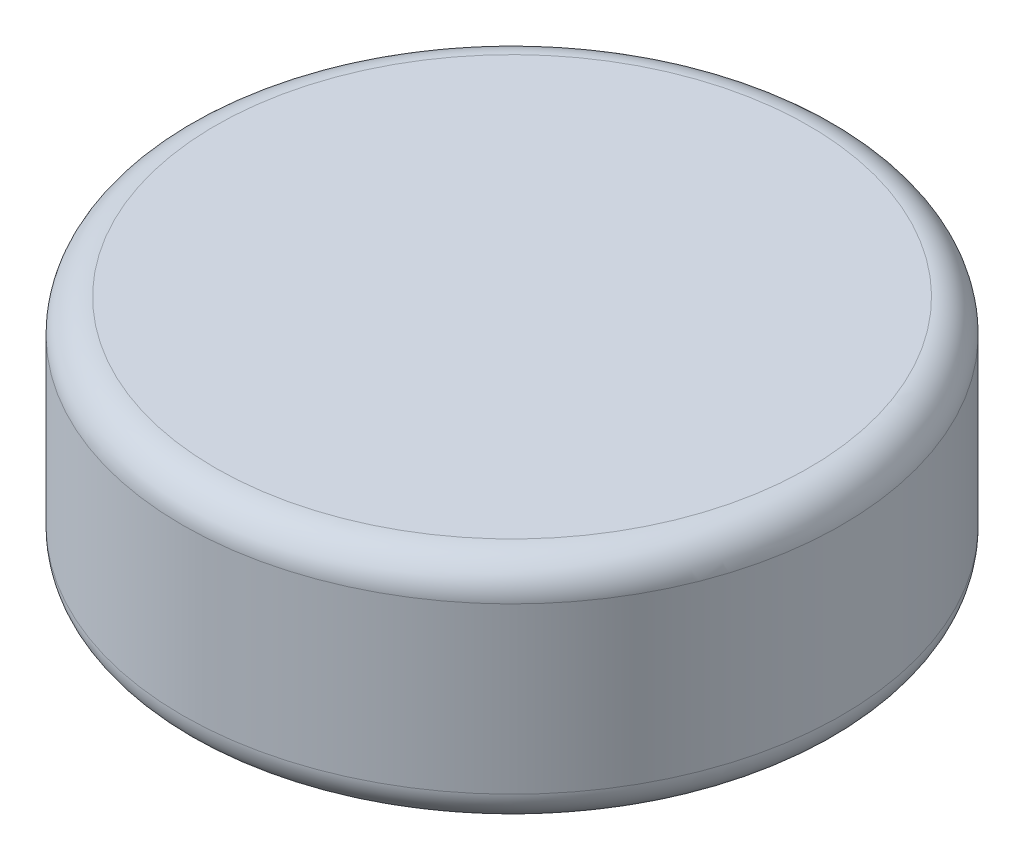
ISO-10303-21;
HEADER;
FILE_DESCRIPTION(('STEP AP214'),'2;1');
FILE_NAME('part.step','',(''),(''),'','','');
FILE_SCHEMA(('AUTOMOTIVE_DESIGN { 1 0 10303 214 1 1 1 1 }'));
ENDSEC;
DATA;
#1=APPLICATION_CONTEXT('core data for automotive mechanical design processes');
#2=APPLICATION_PROTOCOL_DEFINITION('international standard','automotive_design',2000,#1);
#3=PRODUCT_CONTEXT('',#1,'mechanical');
#4=PRODUCT('Part','Part','',(#3));
#5=PRODUCT_RELATED_PRODUCT_CATEGORY('part','',(#4));
#6=PRODUCT_DEFINITION_FORMATION('','',#4);
#7=PRODUCT_DEFINITION_CONTEXT('part definition',#1,'design');
#8=PRODUCT_DEFINITION('design','',#6,#7);
#9=PRODUCT_DEFINITION_SHAPE('','',#8);
#10=(LENGTH_UNIT() NAMED_UNIT(*) SI_UNIT(.MILLI.,.METRE.));
#11=(NAMED_UNIT(*) PLANE_ANGLE_UNIT() SI_UNIT($,.RADIAN.));
#12=(NAMED_UNIT(*) SI_UNIT($,.STERADIAN.) SOLID_ANGLE_UNIT());
#13=UNCERTAINTY_MEASURE_WITH_UNIT(LENGTH_MEASURE(1.E-05),#10,'distance_accuracy_value','');
#14=(GEOMETRIC_REPRESENTATION_CONTEXT(3) GLOBAL_UNCERTAINTY_ASSIGNED_CONTEXT((#13)) GLOBAL_UNIT_ASSIGNED_CONTEXT((#10,
#11,#12)) REPRESENTATION_CONTEXT('',''));
#15=CARTESIAN_POINT('',(0.,0.,0.));
#16=DIRECTION('',(0.,0.,1.));
#17=DIRECTION('',(1.,0.,0.));
#18=AXIS2_PLACEMENT_3D('',#15,#16,#17);
#19=CARTESIAN_POINT('',(0.,3.5,0.));
#20=DIRECTION('',(0.,-1.,0.));
#21=DIRECTION('',(0.,0.,-1.));
#22=AXIS2_PLACEMENT_3D('',#19,#20,#21);
#23=CYLINDRICAL_SURFACE('',#22,5.);
#24=CARTESIAN_POINT('',(0.,0.5,0.));
#25=DIRECTION('',(0.,1.,0.));
#26=DIRECTION('',(0.,0.,1.));
#27=AXIS2_PLACEMENT_3D('',#24,#25,#26);
#28=CIRCLE('',#27,5.);
#29=CARTESIAN_POINT('',(0.,0.5,5.));
#30=VERTEX_POINT('',#29);
#31=EDGE_CURVE('E50',#30,#30,#28,.T.);
#32=ORIENTED_EDGE('',*,*,#31,.T.);
#33=EDGE_LOOP('',(#32));
#34=FACE_BOUND('',#33,.T.);
#35=CARTESIAN_POINT('',(0.,3.,0.));
#36=DIRECTION('',(0.,1.,0.));
#37=DIRECTION('',(0.,0.,1.));
#38=AXIS2_PLACEMENT_3D('',#35,#36,#37);
#39=CIRCLE('',#38,5.);
#40=CARTESIAN_POINT('',(0.,3.,5.));
#41=VERTEX_POINT('',#40);
#42=EDGE_CURVE('E55',#41,#41,#39,.F.);
#43=ORIENTED_EDGE('',*,*,#42,.T.);
#44=EDGE_LOOP('',(#43));
#45=FACE_BOUND('',#44,.T.);
#46=ADVANCED_FACE('F37',(#34,#45),#23,.T.);
#47=CARTESIAN_POINT('',(0.,3.5,0.));
#48=DIRECTION('',(0.,1.,0.));
#49=DIRECTION('',(0.,0.,1.));
#50=AXIS2_PLACEMENT_3D('',#47,#48,#49);
#51=PLANE('',#50);
#52=CARTESIAN_POINT('',(0.,3.5,0.));
#53=DIRECTION('',(0.,1.,0.));
#54=DIRECTION('',(0.,0.,1.));
#55=AXIS2_PLACEMENT_3D('',#52,#53,#54);
#56=CIRCLE('',#55,4.5);
#57=CARTESIAN_POINT('',(0.,3.5,4.5));
#58=VERTEX_POINT('',#57);
#59=EDGE_CURVE('E10',#58,#58,#56,.T.);
#60=ORIENTED_EDGE('',*,*,#59,.T.);
#61=EDGE_LOOP('',(#60));
#62=FACE_BOUND('',#61,.T.);
#63=ADVANCED_FACE('F72',(#62),#51,.T.);
#64=CARTESIAN_POINT('',(0.,0.,0.));
#65=DIRECTION('',(0.,1.,0.));
#66=DIRECTION('',(0.,0.,1.));
#67=AXIS2_PLACEMENT_3D('',#64,#65,#66);
#68=PLANE('',#67);
#69=CARTESIAN_POINT('',(0.,0.,0.));
#70=DIRECTION('',(0.,1.,0.));
#71=DIRECTION('',(0.,0.,1.));
#72=AXIS2_PLACEMENT_3D('',#69,#70,#71);
#73=CIRCLE('',#72,4.5);
#74=CARTESIAN_POINT('',(0.,0.,4.5));
#75=VERTEX_POINT('',#74);
#76=EDGE_CURVE('E45',#75,#75,#73,.F.);
#77=ORIENTED_EDGE('',*,*,#76,.T.);
#78=EDGE_LOOP('',(#77));
#79=FACE_BOUND('',#78,.T.);
#80=ADVANCED_FACE('F69',(#79),#68,.F.);
#81=CARTESIAN_POINT('',(0.,0.5,0.));
#82=DIRECTION('',(0.,1.,0.));
#83=DIRECTION('',(0.,0.,1.));
#84=AXIS2_PLACEMENT_3D('',#81,#82,#83);
#85=TOROIDAL_SURFACE('',#84,4.5,0.5);
#86=ORIENTED_EDGE('',*,*,#76,.F.);
#87=EDGE_LOOP('',(#86));
#88=FACE_BOUND('',#87,.T.);
#89=ORIENTED_EDGE('',*,*,#31,.F.);
#90=EDGE_LOOP('',(#89));
#91=FACE_BOUND('',#90,.T.);
#92=ADVANCED_FACE('F65',(#88,#91),#85,.T.);
#93=CARTESIAN_POINT('',(0.,3.,0.));
#94=DIRECTION('',(0.,1.,0.));
#95=DIRECTION('',(0.,0.,1.));
#96=AXIS2_PLACEMENT_3D('',#93,#94,#95);
#97=TOROIDAL_SURFACE('',#96,4.5,0.5);
#98=ORIENTED_EDGE('',*,*,#42,.F.);
#99=EDGE_LOOP('',(#98));
#100=FACE_BOUND('',#99,.T.);
#101=ORIENTED_EDGE('',*,*,#59,.F.);
#102=EDGE_LOOP('',(#101));
#103=FACE_BOUND('',#102,.T.);
#104=ADVANCED_FACE('F39',(#100,#103),#97,.T.);
#105=CLOSED_SHELL('',(#46,#63,#80,#92,#104));
#106=MANIFOLD_SOLID_BREP('B2',#105);
#107=ADVANCED_BREP_SHAPE_REPRESENTATION('',(#18,#106),#14);
#108=SHAPE_DEFINITION_REPRESENTATION(#9,#107);
ENDSEC;
END-ISO-10303-21;
